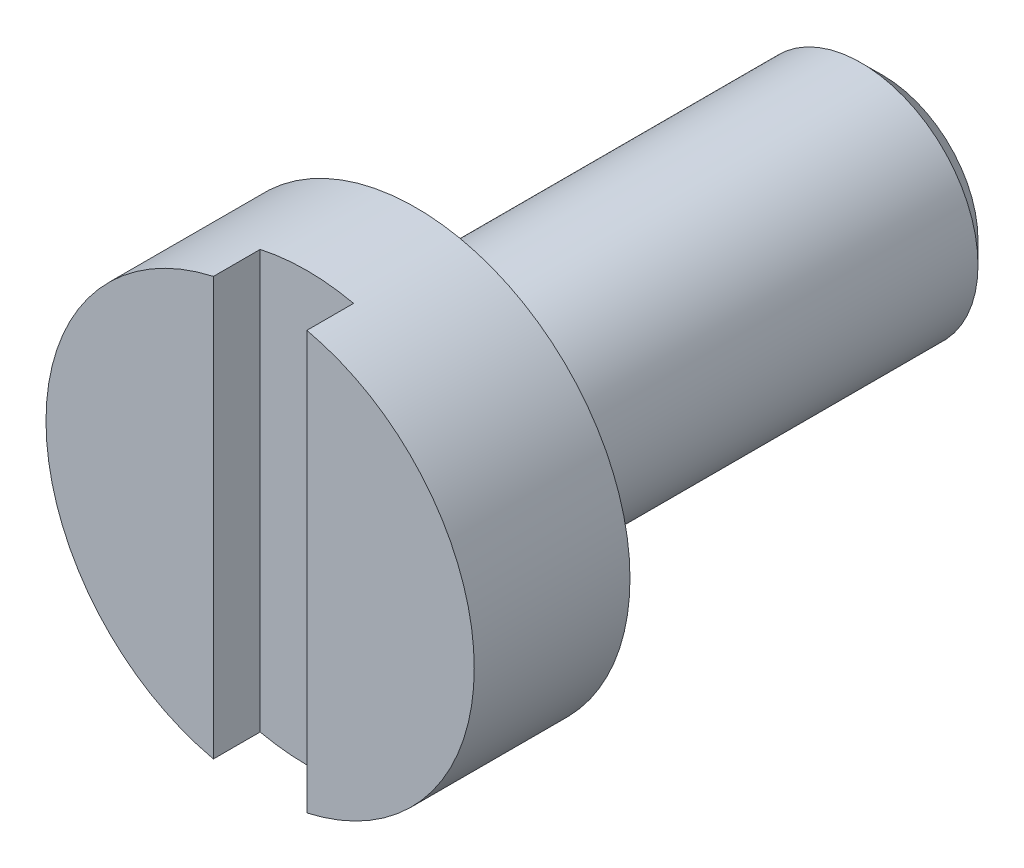
ISO-10303-21;
HEADER;
FILE_DESCRIPTION(('STEP AP214'),'2;1');
FILE_NAME('part.step','',(''),(''),'','','');
FILE_SCHEMA(('AUTOMOTIVE_DESIGN { 1 0 10303 214 1 1 1 1 }'));
ENDSEC;
DATA;
#1=APPLICATION_CONTEXT('core data for automotive mechanical design processes');
#2=APPLICATION_PROTOCOL_DEFINITION('international standard','automotive_design',2000,#1);
#3=PRODUCT_CONTEXT('',#1,'mechanical');
#4=PRODUCT('Part','Part','',(#3));
#5=PRODUCT_RELATED_PRODUCT_CATEGORY('part','',(#4));
#6=PRODUCT_DEFINITION_FORMATION('','',#4);
#7=PRODUCT_DEFINITION_CONTEXT('part definition',#1,'design');
#8=PRODUCT_DEFINITION('design','',#6,#7);
#9=PRODUCT_DEFINITION_SHAPE('','',#8);
#10=(LENGTH_UNIT() NAMED_UNIT(*) SI_UNIT(.MILLI.,.METRE.));
#11=(NAMED_UNIT(*) PLANE_ANGLE_UNIT() SI_UNIT($,.RADIAN.));
#12=(NAMED_UNIT(*) SI_UNIT($,.STERADIAN.) SOLID_ANGLE_UNIT());
#13=UNCERTAINTY_MEASURE_WITH_UNIT(LENGTH_MEASURE(1.E-05),#10,'distance_accuracy_value','');
#14=(GEOMETRIC_REPRESENTATION_CONTEXT(3) GLOBAL_UNCERTAINTY_ASSIGNED_CONTEXT((#13)) GLOBAL_UNIT_ASSIGNED_CONTEXT((#10,
#11,#12)) REPRESENTATION_CONTEXT('',''));
#15=CARTESIAN_POINT('',(0.,0.,0.));
#16=DIRECTION('',(0.,0.,1.));
#17=DIRECTION('',(1.,0.,0.));
#18=AXIS2_PLACEMENT_3D('',#15,#16,#17);
#19=CARTESIAN_POINT('',(-4.73579508941668E-13,0.,2.));
#20=DIRECTION('',(0.,0.,-0.999999999999823));
#21=DIRECTION('',(-1.00000000000016,0.,0.));
#22=AXIS2_PLACEMENT_3D('',#19,#20,#21);
#23=CYLINDRICAL_SURFACE('',#22,2.75);
#24=CARTESIAN_POINT('',(0.,0.,0.));
#25=DIRECTION('',(0.,0.,0.999999999999823));
#26=DIRECTION('',(1.00000000000016,0.,0.));
#27=AXIS2_PLACEMENT_3D('',#24,#25,#26);
#28=CIRCLE('',#27,2.75);
#29=CARTESIAN_POINT('',(2.75000000000045,0.,0.));
#30=VERTEX_POINT('',#29);
#31=EDGE_CURVE('E100',#30,#30,#28,.T.);
#32=ORIENTED_EDGE('',*,*,#31,.T.);
#33=EDGE_LOOP('',(#32));
#34=FACE_BOUND('',#33,.T.);
#35=DIRECTION('',(0.,0.,-0.999999999999823));
#36=VECTOR('',#35,1.);
#37=CARTESIAN_POINT('',(0.600000000000069,-2.68374738006429,2.00000000000029));
#38=LINE('',#37,#36);
#39=CARTESIAN_POINT('',(0.599999999999953,-2.68374738006426,1.40000000000029));
#40=VERTEX_POINT('',#39);
#41=CARTESIAN_POINT('',(0.600000000000069,-2.68374738006429,2.00000000000029));
#42=VERTEX_POINT('',#41);
#43=EDGE_CURVE('E59',#40,#42,#38,.F.);
#44=ORIENTED_EDGE('',*,*,#43,.F.);
#45=CARTESIAN_POINT('',(-4.87457296749483E-13,0.,1.4));
#46=DIRECTION('',(0.,0.,0.999999999999823));
#47=DIRECTION('',(1.00000000000016,0.,0.));
#48=AXIS2_PLACEMENT_3D('',#45,#46,#47);
#49=CIRCLE('',#48,2.75);
#50=CARTESIAN_POINT('',(-0.600000000000477,-2.68374738006494,1.39999999999999));
#51=VERTEX_POINT('',#50);
#52=EDGE_CURVE('E11',#51,#40,#49,.T.);
#53=ORIENTED_EDGE('',*,*,#52,.F.);
#54=DIRECTION('',(0.,0.,-0.999999999999823));
#55=VECTOR('',#54,1.);
#56=CARTESIAN_POINT('',(-0.600000000000477,-2.68374738006494,1.99999999999999));
#57=LINE('',#56,#55);
#58=CARTESIAN_POINT('',(-0.600000000000477,-2.68374738006494,1.99999999999999));
#59=VERTEX_POINT('',#58);
#60=EDGE_CURVE('E88',#59,#51,#57,.T.);
#61=ORIENTED_EDGE('',*,*,#60,.F.);
#62=CARTESIAN_POINT('',(-4.73579508941668E-13,0.,2.));
#63=DIRECTION('',(0.,0.,0.999999999999823));
#64=DIRECTION('',(1.00000000000016,0.,0.));
#65=AXIS2_PLACEMENT_3D('',#62,#63,#64);
#66=CIRCLE('',#65,2.75);
#67=CARTESIAN_POINT('',(-0.600000000000028,2.68374738006386,1.99999999999999));
#68=VERTEX_POINT('',#67);
#69=EDGE_CURVE('E92',#68,#59,#66,.T.);
#70=ORIENTED_EDGE('',*,*,#69,.F.);
#71=DIRECTION('',(0.,0.,-0.999999999999823));
#72=VECTOR('',#71,1.);
#73=CARTESIAN_POINT('',(-0.600000000000028,2.68374738006386,1.99999999999999));
#74=LINE('',#73,#72);
#75=CARTESIAN_POINT('',(-0.599999999999996,2.68374738006386,1.39999999999999));
#76=VERTEX_POINT('',#75);
#77=EDGE_CURVE('E51',#76,#68,#74,.F.);
#78=ORIENTED_EDGE('',*,*,#77,.F.);
#79=CARTESIAN_POINT('',(0.599999999999989,2.68374738006406,1.39999999999999));
#80=VERTEX_POINT('',#79);
#81=EDGE_CURVE('E40',#80,#76,#49,.T.);
#82=ORIENTED_EDGE('',*,*,#81,.F.);
#83=DIRECTION('',(0.,0.,-0.999999999999823));
#84=VECTOR('',#83,1.);
#85=CARTESIAN_POINT('',(0.599999999999979,2.68374738006407,1.99999999999999));
#86=LINE('',#85,#84);
#87=CARTESIAN_POINT('',(0.599999999999979,2.68374738006407,1.99999999999999));
#88=VERTEX_POINT('',#87);
#89=EDGE_CURVE('E98',#88,#80,#86,.T.);
#90=ORIENTED_EDGE('',*,*,#89,.F.);
#91=EDGE_CURVE('E101',#42,#88,#66,.T.);
#92=ORIENTED_EDGE('',*,*,#91,.F.);
#93=EDGE_LOOP('',(#44,#53,#61,#70,#78,#82,#90,#92));
#94=FACE_BOUND('',#93,.T.);
#95=ADVANCED_FACE('F36',(#34,#94),#23,.T.);
#96=CARTESIAN_POINT('',(-4.73579508941668E-13,0.,2.));
#97=DIRECTION('',(0.,0.,0.999999999999823));
#98=DIRECTION('',(1.00000000000016,0.,0.));
#99=AXIS2_PLACEMENT_3D('',#96,#97,#98);
#100=PLANE('',#99);
#101=ORIENTED_EDGE('',*,*,#91,.T.);
#102=DIRECTION('',(0.,-1.00000000000016,0.));
#103=VECTOR('',#102,1.);
#104=CARTESIAN_POINT('',(0.599999999999557,0.,1.99999999999997));
#105=LINE('',#104,#103);
#106=EDGE_CURVE('E85',#88,#42,#105,.T.);
#107=ORIENTED_EDGE('',*,*,#106,.T.);
#108=EDGE_LOOP('',(#101,#107));
#109=FACE_BOUND('',#108,.T.);
#110=ADVANCED_FACE('F118',(#109),#100,.T.);
#111=ORIENTED_EDGE('',*,*,#69,.T.);
#112=DIRECTION('',(0.,1.00000000000016,0.));
#113=VECTOR('',#112,1.);
#114=CARTESIAN_POINT('',(-0.60000000000047,0.,2.));
#115=LINE('',#114,#113);
#116=EDGE_CURVE('E115',#59,#68,#115,.T.);
#117=ORIENTED_EDGE('',*,*,#116,.T.);
#118=EDGE_LOOP('',(#111,#117));
#119=FACE_BOUND('',#118,.T.);
#120=ADVANCED_FACE('F134',(#119),#100,.T.);
#121=CARTESIAN_POINT('',(0.,0.,0.));
#122=DIRECTION('',(0.,0.,0.999999999999823));
#123=DIRECTION('',(1.00000000000016,0.,0.));
#124=AXIS2_PLACEMENT_3D('',#121,#122,#123);
#125=PLANE('',#124);
#126=ORIENTED_EDGE('',*,*,#31,.F.);
#127=EDGE_LOOP('',(#126));
#128=FACE_BOUND('',#127,.T.);
#129=CARTESIAN_POINT('',(0.,0.,0.));
#130=DIRECTION('',(0.,0.,0.999999999999823));
#131=DIRECTION('',(1.00000000000016,0.,0.));
#132=AXIS2_PLACEMENT_3D('',#129,#130,#131);
#133=CIRCLE('',#132,1.5);
#134=CARTESIAN_POINT('',(1.50000000000025,0.,0.));
#135=VERTEX_POINT('',#134);
#136=EDGE_CURVE('E106',#135,#135,#133,.F.);
#137=ORIENTED_EDGE('',*,*,#136,.F.);
#138=EDGE_LOOP('',(#137));
#139=FACE_BOUND('',#138,.T.);
#140=ADVANCED_FACE('F137',(#128,#139),#125,.F.);
#141=CARTESIAN_POINT('',(0.,0.,-5.99999999999904));
#142=DIRECTION('',(0.,0.,0.999999999999823));
#143=DIRECTION('',(1.00000000000016,0.,0.));
#144=AXIS2_PLACEMENT_3D('',#141,#142,#143);
#145=CYLINDRICAL_SURFACE('',#144,1.5);
#146=CARTESIAN_POINT('',(0.,0.,-5.71949999999903));
#147=DIRECTION('',(0.,0.,-0.999999999999823));
#148=DIRECTION('',(-1.00000000000016,0.,0.));
#149=AXIS2_PLACEMENT_3D('',#146,#147,#148);
#150=CIRCLE('',#149,1.5);
#151=CARTESIAN_POINT('',(1.50000000000025,0.,-5.71949999999904));
#152=VERTEX_POINT('',#151);
#153=EDGE_CURVE('E112',#152,#152,#150,.F.);
#154=CARTESIAN_POINT('',(1.50000000000025,0.,-5.71949999999904));
#155=CARTESIAN_POINT('',(1.50000000000025,0.,-5.65992187499905));
#156=CARTESIAN_POINT('',(1.50000000000025,0.,-5.60034374999905));
#157=CARTESIAN_POINT('',(1.50000000000025,0.,-5.48118749999908));
#158=CARTESIAN_POINT('',(1.50000000000025,0.,-5.42160937499908));
#159=CARTESIAN_POINT('',(1.50000000000025,0.,-5.30245312499911));
#160=CARTESIAN_POINT('',(1.50000000000025,0.,-5.24287499999912));
#161=CARTESIAN_POINT('',(1.50000000000025,0.,-5.12371874999914));
#162=CARTESIAN_POINT('',(1.50000000000025,0.,-5.06414062499914));
#163=CARTESIAN_POINT('',(1.50000000000025,0.,-4.94498437499917));
#164=CARTESIAN_POINT('',(1.50000000000025,0.,-4.88540624999917));
#165=CARTESIAN_POINT('',(1.50000000000025,0.,-4.7662499999992));
#166=CARTESIAN_POINT('',(1.50000000000025,0.,-4.70667187499921));
#167=CARTESIAN_POINT('',(1.50000000000025,0.,-4.58751562499923));
#168=CARTESIAN_POINT('',(1.50000000000025,0.,-4.52793749999924));
#169=CARTESIAN_POINT('',(1.50000000000025,0.,-4.40878124999926));
#170=CARTESIAN_POINT('',(1.50000000000025,0.,-4.34920312499927));
#171=CARTESIAN_POINT('',(1.50000000000025,0.,-4.23004687499929));
#172=CARTESIAN_POINT('',(1.50000000000025,0.,-4.1704687499993));
#173=CARTESIAN_POINT('',(1.50000000000025,0.,-4.05131249999932));
#174=CARTESIAN_POINT('',(1.50000000000025,0.,-3.99173437499933));
#175=CARTESIAN_POINT('',(1.50000000000025,0.,-3.87257812499935));
#176=CARTESIAN_POINT('',(1.50000000000025,0.,-3.81299999999936));
#177=CARTESIAN_POINT('',(1.50000000000025,0.,-3.69384374999938));
#178=CARTESIAN_POINT('',(1.50000000000025,0.,-3.63426562499939));
#179=CARTESIAN_POINT('',(1.50000000000025,0.,-3.51510937499941));
#180=CARTESIAN_POINT('',(1.50000000000025,0.,-3.45553124999942));
#181=CARTESIAN_POINT('',(1.50000000000025,0.,-3.33637499999944));
#182=CARTESIAN_POINT('',(1.50000000000025,0.,-3.27679687499945));
#183=CARTESIAN_POINT('',(1.50000000000025,0.,-3.15764062499947));
#184=CARTESIAN_POINT('',(1.50000000000025,0.,-3.09806249999948));
#185=CARTESIAN_POINT('',(1.50000000000025,0.,-2.9789062499995));
#186=CARTESIAN_POINT('',(1.50000000000025,0.,-2.91932812499951));
#187=CARTESIAN_POINT('',(1.50000000000025,0.,-2.80017187499953));
#188=CARTESIAN_POINT('',(1.50000000000025,0.,-2.74059374999954));
#189=CARTESIAN_POINT('',(1.50000000000025,0.,-2.62143749999956));
#190=CARTESIAN_POINT('',(1.50000000000025,0.,-2.56185937499957));
#191=CARTESIAN_POINT('',(1.50000000000025,0.,-2.44270312499959));
#192=CARTESIAN_POINT('',(1.50000000000025,0.,-2.3831249999996));
#193=CARTESIAN_POINT('',(1.50000000000025,0.,-2.26396874999962));
#194=CARTESIAN_POINT('',(1.50000000000025,0.,-2.20439062499963));
#195=CARTESIAN_POINT('',(1.50000000000025,0.,-2.08523437499965));
#196=CARTESIAN_POINT('',(1.50000000000025,0.,-2.02565624999966));
#197=CARTESIAN_POINT('',(1.50000000000025,0.,-1.90649999999968));
#198=CARTESIAN_POINT('',(1.50000000000025,0.,-1.84692187499969));
#199=CARTESIAN_POINT('',(1.50000000000025,0.,-1.72776562499971));
#200=CARTESIAN_POINT('',(1.50000000000025,0.,-1.66818749999972));
#201=CARTESIAN_POINT('',(1.50000000000025,0.,-1.54903124999974));
#202=CARTESIAN_POINT('',(1.50000000000025,0.,-1.48945312499975));
#203=CARTESIAN_POINT('',(1.50000000000025,0.,-1.37029687499977));
#204=CARTESIAN_POINT('',(1.50000000000025,0.,-1.31071874999978));
#205=CARTESIAN_POINT('',(1.50000000000025,0.,-1.1915624999998));
#206=CARTESIAN_POINT('',(1.50000000000025,0.,-1.13198437499981));
#207=CARTESIAN_POINT('',(1.50000000000025,0.,-1.01282812499983));
#208=CARTESIAN_POINT('',(1.50000000000025,0.,-0.95324999999984));
#209=CARTESIAN_POINT('',(1.50000000000025,0.,-0.83409374999986));
#210=CARTESIAN_POINT('',(1.50000000000025,0.,-0.77451562499987));
#211=CARTESIAN_POINT('',(1.50000000000025,0.,-0.65535937499989));
#212=CARTESIAN_POINT('',(1.50000000000025,0.,-0.595781249999901));
#213=CARTESIAN_POINT('',(1.50000000000025,0.,-0.47662499999992));
#214=CARTESIAN_POINT('',(1.50000000000025,0.,-0.41704687499993));
#215=CARTESIAN_POINT('',(1.50000000000025,0.,-0.297890624999951));
#216=CARTESIAN_POINT('',(1.50000000000025,0.,-0.238312499999961));
#217=CARTESIAN_POINT('',(1.50000000000025,0.,-0.119156249999981));
#218=CARTESIAN_POINT('',(1.50000000000025,0.,-0.0595781249999909));
#219=CARTESIAN_POINT('',(1.50000000000025,0.,0.));
#220=B_SPLINE_CURVE_WITH_KNOTS('',3,(#154,#155,#156,#157,#158,#159,#160,#161,#162,#163,#164,
#165,#166,#167,#168,#169,#170,#171,#172,#173,#174,#175,#176,#177,#178,#179,#180,#181,#182,#183,
#184,#185,#186,#187,#188,#189,#190,#191,#192,#193,#194,#195,#196,#197,#198,#199,#200,#201,#202,
#203,#204,#205,#206,#207,#208,#209,#210,#211,#212,#213,#214,#215,#216,#217,#218,#219),
.UNSPECIFIED.,.F.,.F.,(4,2,2,2,2,2,2,2,2,2,2,2,2,2,2,2,2,2,2,2,2,2,2,2,2,2,2,2,2,2,2,2,4),(0.,
0.17873437499997,0.35746874999994,0.53620312499991,0.71493749999988,0.89367187499985,
1.07240624999982,1.25114062499979,1.42987499999976,1.60860937499973,1.7873437499997,
1.96607812499967,2.14481249999964,2.32354687499961,2.50228124999958,2.68101562499955,
2.85974999999952,3.03848437499949,3.21721874999946,3.39595312499943,3.5746874999994,
3.75342187499937,3.93215624999934,4.11089062499931,4.28962499999928,4.46835937499925,
4.64709374999922,4.82582812499919,5.00456249999915,5.18329687499913,5.3620312499991,
5.54076562499906,5.71949999999903),.UNSPECIFIED.);
#221=EDGE_CURVE('BSEAM139',#152,#135,#220,.T.);
#222=ORIENTED_EDGE('',*,*,#153,.T.);
#223=ORIENTED_EDGE('',*,*,#136,.T.);
#224=ORIENTED_EDGE('',*,*,#221,.T.);
#225=ORIENTED_EDGE('',*,*,#221,.F.);
#226=EDGE_LOOP('',(#222,#224,#223,#225));
#227=FACE_BOUND('',#226,.T.);
#228=ADVANCED_FACE('F139',(#227),#145,.T.);
#229=CARTESIAN_POINT('',(0.,0.,-5.99999999999904));
#230=DIRECTION('',(0.,0.,-0.999999999999823));
#231=DIRECTION('',(-1.00000000000016,0.,0.));
#232=AXIS2_PLACEMENT_3D('',#229,#230,#231);
#233=PLANE('',#232);
#234=CARTESIAN_POINT('',(0.,0.,-5.99999999999904));
#235=DIRECTION('',(0.,0.,-0.999999999999823));
#236=DIRECTION('',(-1.00000000000016,0.,0.));
#237=AXIS2_PLACEMENT_3D('',#234,#235,#236);
#238=CIRCLE('',#237,1.2195);
#239=CARTESIAN_POINT('',(1.2195000000002,0.,-5.99999999999904));
#240=VERTEX_POINT('',#239);
#241=EDGE_CURVE('E109',#240,#240,#238,.T.);
#242=ORIENTED_EDGE('',*,*,#241,.T.);
#243=EDGE_LOOP('',(#242));
#244=FACE_BOUND('',#243,.T.);
#245=ADVANCED_FACE('F143',(#244),#233,.T.);
#246=CARTESIAN_POINT('',(0.,0.,-5.99999999999904));
#247=DIRECTION('',(0.,0.,0.999999999999823));
#248=DIRECTION('',(1.00000000000016,0.,0.));
#249=AXIS2_PLACEMENT_3D('',#246,#247,#248);
#250=CONICAL_SURFACE('',#249,1.2195,0.785398163397442);
#251=CARTESIAN_POINT('',(1.5000000000003,0.,-5.71949999999904));
#252=CARTESIAN_POINT('',(1.4970781250003,0.,-5.72242187499903));
#253=CARTESIAN_POINT('',(1.4941562500003,0.,-5.72534374999903));
#254=CARTESIAN_POINT('',(1.48831250000029,0.,-5.73118749999903));
#255=CARTESIAN_POINT('',(1.48539062500029,0.,-5.73410937499904));
#256=CARTESIAN_POINT('',(1.47954687500029,0.,-5.73995312499903));
#257=CARTESIAN_POINT('',(1.47662500000029,0.,-5.74287499999904));
#258=CARTESIAN_POINT('',(1.47078125000029,0.,-5.74871874999903));
#259=CARTESIAN_POINT('',(1.46785937500029,0.,-5.75164062499904));
#260=CARTESIAN_POINT('',(1.46201562500029,0.,-5.75748437499904));
#261=CARTESIAN_POINT('',(1.45909375000028,0.,-5.76040624999904));
#262=CARTESIAN_POINT('',(1.45325000000028,0.,-5.76624999999903));
#263=CARTESIAN_POINT('',(1.45032812500028,0.,-5.76917187499904));
#264=CARTESIAN_POINT('',(1.44448437500028,0.,-5.77501562499904));
#265=CARTESIAN_POINT('',(1.44156250000028,0.,-5.77793749999904));
#266=CARTESIAN_POINT('',(1.43571875000028,0.,-5.78378124999904));
#267=CARTESIAN_POINT('',(1.43279687500028,0.,-5.78670312499904));
#268=CARTESIAN_POINT('',(1.42695312500027,0.,-5.79254687499904));
#269=CARTESIAN_POINT('',(1.42403125000027,0.,-5.79546874999904));
#270=CARTESIAN_POINT('',(1.41818750000027,0.,-5.80131249999904));
#271=CARTESIAN_POINT('',(1.41526562500027,0.,-5.80423437499904));
#272=CARTESIAN_POINT('',(1.40942187500027,0.,-5.81007812499904));
#273=CARTESIAN_POINT('',(1.40650000000027,0.,-5.81299999999904));
#274=CARTESIAN_POINT('',(1.40065625000026,0.,-5.81884374999904));
#275=CARTESIAN_POINT('',(1.39773437500026,0.,-5.82176562499904));
#276=CARTESIAN_POINT('',(1.39189062500026,0.,-5.82760937499904));
#277=CARTESIAN_POINT('',(1.38896875000026,0.,-5.83053124999904));
#278=CARTESIAN_POINT('',(1.38312500000026,0.,-5.83637499999904));
#279=CARTESIAN_POINT('',(1.38020312500026,0.,-5.83929687499904));
#280=CARTESIAN_POINT('',(1.37435937500026,0.,-5.84514062499904));
#281=CARTESIAN_POINT('',(1.37143750000025,0.,-5.84806249999904));
#282=CARTESIAN_POINT('',(1.36559375000025,0.,-5.85390624999904));
#283=CARTESIAN_POINT('',(1.36267187500025,0.,-5.85682812499904));
#284=CARTESIAN_POINT('',(1.35682812500025,0.,-5.86267187499904));
#285=CARTESIAN_POINT('',(1.35390625000025,0.,-5.86559374999904));
#286=CARTESIAN_POINT('',(1.34806250000025,0.,-5.87143749999904));
#287=CARTESIAN_POINT('',(1.34514062500025,0.,-5.87435937499904));
#288=CARTESIAN_POINT('',(1.33929687500024,0.,-5.88020312499904));
#289=CARTESIAN_POINT('',(1.33637500000024,0.,-5.88312499999904));
#290=CARTESIAN_POINT('',(1.33053125000024,0.,-5.88896874999904));
#291=CARTESIAN_POINT('',(1.32760937500024,0.,-5.89189062499904));
#292=CARTESIAN_POINT('',(1.32176562500024,0.,-5.89773437499904));
#293=CARTESIAN_POINT('',(1.31884375000024,0.,-5.90065624999904));
#294=CARTESIAN_POINT('',(1.31300000000024,0.,-5.90649999999904));
#295=CARTESIAN_POINT('',(1.31007812500023,0.,-5.90942187499904));
#296=CARTESIAN_POINT('',(1.30423437500023,0.,-5.91526562499904));
#297=CARTESIAN_POINT('',(1.30131250000023,0.,-5.91818749999904));
#298=CARTESIAN_POINT('',(1.29546875000023,0.,-5.92403124999904));
#299=CARTESIAN_POINT('',(1.29254687500023,0.,-5.92695312499904));
#300=CARTESIAN_POINT('',(1.28670312500023,0.,-5.93279687499904));
#301=CARTESIAN_POINT('',(1.28378125000023,0.,-5.93571874999904));
#302=CARTESIAN_POINT('',(1.27793750000022,0.,-5.94156249999904));
#303=CARTESIAN_POINT('',(1.27501562500022,0.,-5.94448437499904));
#304=CARTESIAN_POINT('',(1.26917187500022,0.,-5.95032812499904));
#305=CARTESIAN_POINT('',(1.26625000000022,0.,-5.95324999999904));
#306=CARTESIAN_POINT('',(1.26040625000022,0.,-5.95909374999904));
#307=CARTESIAN_POINT('',(1.25748437500022,0.,-5.96201562499904));
#308=CARTESIAN_POINT('',(1.25164062500021,0.,-5.96785937499904));
#309=CARTESIAN_POINT('',(1.24871875000021,0.,-5.97078124999904));
#310=CARTESIAN_POINT('',(1.24287500000021,0.,-5.97662499999904));
#311=CARTESIAN_POINT('',(1.23995312500021,0.,-5.97954687499904));
#312=CARTESIAN_POINT('',(1.23410937500021,0.,-5.98539062499904));
#313=CARTESIAN_POINT('',(1.23118750000021,0.,-5.98831249999904));
#314=CARTESIAN_POINT('',(1.22534375000021,0.,-5.99415624999904));
#315=CARTESIAN_POINT('',(1.2224218750002,0.,-5.99707812499904));
#316=CARTESIAN_POINT('',(1.2195000000002,0.,-5.99999999999904));
#317=B_SPLINE_CURVE_WITH_KNOTS('',3,(#251,#252,#253,#254,#255,#256,#257,#258,#259,#260,#261,
#262,#263,#264,#265,#266,#267,#268,#269,#270,#271,#272,#273,#274,#275,#276,#277,#278,#279,#280,
#281,#282,#283,#284,#285,#286,#287,#288,#289,#290,#291,#292,#293,#294,#295,#296,#297,#298,#299,
#300,#301,#302,#303,#304,#305,#306,#307,#308,#309,#310,#311,#312,#313,#314,#315,#316),
.UNSPECIFIED.,.F.,.F.,(4,2,2,2,2,2,2,2,2,2,2,2,2,2,2,2,2,2,2,2,2,2,2,2,2,2,2,2,2,2,2,2,4),(0.,
0.0123964657576786,0.0247929315153577,0.0371893972730362,0.0495858630307155,0.0619823287883939,
0.074378794546073,0.0867752603037515,0.0991717260614306,0.111568191819109,0.123964657576788,
0.136361123334467,0.148757589092146,0.161154054849824,0.173550520607503,0.185946986365182,
0.198343452122861,0.21073991788054,0.223136383638219,0.235532849395897,0.247929315153576,
0.260325780911255,0.272722246668934,0.285118712426613,0.297515178184292,0.30991164394197,
0.322308109699649,0.334704575457328,0.347101041215007,0.359497506972686,0.371893972730365,
0.384290438488043,0.396686904245722),.UNSPECIFIED.);
#318=EDGE_CURVE('BSEAM38',#152,#240,#317,.T.);
#319=ORIENTED_EDGE('',*,*,#153,.F.);
#320=ORIENTED_EDGE('',*,*,#241,.F.);
#321=ORIENTED_EDGE('',*,*,#318,.T.);
#322=ORIENTED_EDGE('',*,*,#318,.F.);
#323=EDGE_LOOP('',(#319,#321,#320,#322));
#324=FACE_BOUND('',#323,.T.);
#325=ADVANCED_FACE('F38',(#324),#250,.T.);
#326=CARTESIAN_POINT('',(-0.600000000000449,38.0000000000049,1.40000000000029));
#327=DIRECTION('',(0.,0.,0.999999999999823));
#328=DIRECTION('',(1.00000000000016,0.,0.));
#329=AXIS2_PLACEMENT_3D('',#326,#327,#328);
#330=PLANE('',#329);
#331=ORIENTED_EDGE('',*,*,#81,.T.);
#332=DIRECTION('',(0.,-1.00000000000016,0.));
#333=VECTOR('',#332,1.);
#334=CARTESIAN_POINT('',(-0.600000000000449,38.0000000000049,1.40000000000029));
#335=LINE('',#334,#333);
#336=EDGE_CURVE('E80',#76,#51,#335,.T.);
#337=ORIENTED_EDGE('',*,*,#336,.T.);
#338=ORIENTED_EDGE('',*,*,#52,.T.);
#339=DIRECTION('',(0.,-1.00000000000016,0.));
#340=VECTOR('',#339,1.);
#341=CARTESIAN_POINT('',(0.599999999999585,38.0000000000067,1.40000000000029));
#342=LINE('',#341,#340);
#343=EDGE_CURVE('E82',#80,#40,#342,.T.);
#344=ORIENTED_EDGE('',*,*,#343,.F.);
#345=EDGE_LOOP('',(#331,#337,#338,#344));
#346=FACE_BOUND('',#345,.T.);
#347=ADVANCED_FACE('F79',(#346),#330,.T.);
#348=CARTESIAN_POINT('',(0.599999999999585,38.0000000000067,1.40000000000029));
#349=DIRECTION('',(-1.00000000000016,0.,0.));
#350=DIRECTION('',(0.,0.,0.999999999999823));
#351=AXIS2_PLACEMENT_3D('',#348,#349,#350);
#352=PLANE('',#351);
#353=ORIENTED_EDGE('',*,*,#89,.T.);
#354=ORIENTED_EDGE('',*,*,#343,.T.);
#355=ORIENTED_EDGE('',*,*,#43,.T.);
#356=ORIENTED_EDGE('',*,*,#106,.F.);
#357=EDGE_LOOP('',(#353,#354,#355,#356));
#358=FACE_BOUND('',#357,.T.);
#359=ADVANCED_FACE('F119',(#358),#352,.T.);
#360=CARTESIAN_POINT('',(-0.600000000000449,38.0000000000049,1.40000000000029));
#361=DIRECTION('',(1.00000000000016,0.,0.));
#362=DIRECTION('',(0.,0.,-0.999999999999823));
#363=AXIS2_PLACEMENT_3D('',#360,#361,#362);
#364=PLANE('',#363);
#365=ORIENTED_EDGE('',*,*,#60,.T.);
#366=ORIENTED_EDGE('',*,*,#336,.F.);
#367=ORIENTED_EDGE('',*,*,#77,.T.);
#368=ORIENTED_EDGE('',*,*,#116,.F.);
#369=EDGE_LOOP('',(#365,#366,#367,#368));
#370=FACE_BOUND('',#369,.T.);
#371=ADVANCED_FACE('F86',(#370),#364,.T.);
#372=CLOSED_SHELL('',(#95,#110,#120,#140,#228,#245,#325,#347,#359,#371));
#373=MANIFOLD_SOLID_BREP('B2',#372);
#374=ADVANCED_BREP_SHAPE_REPRESENTATION('',(#18,#373),#14);
#375=SHAPE_DEFINITION_REPRESENTATION(#9,#374);
ENDSEC;
END-ISO-10303-21;
